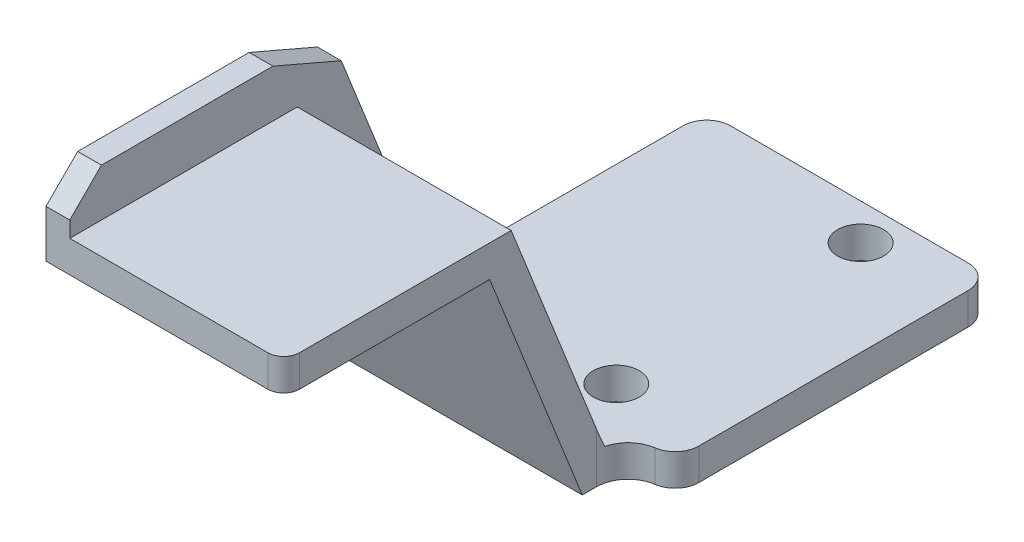
ISO-10303-21;
HEADER;
FILE_DESCRIPTION(('STEP AP214'),'2;1');
FILE_NAME('part.step','',(''),(''),'','','');
FILE_SCHEMA(('AUTOMOTIVE_DESIGN { 1 0 10303 214 1 1 1 1 }'));
ENDSEC;
DATA;
#1=APPLICATION_CONTEXT('core data for automotive mechanical design processes');
#2=APPLICATION_PROTOCOL_DEFINITION('international standard','automotive_design',2000,#1);
#3=PRODUCT_CONTEXT('',#1,'mechanical');
#4=PRODUCT('Part','Part','',(#3));
#5=PRODUCT_RELATED_PRODUCT_CATEGORY('part','',(#4));
#6=PRODUCT_DEFINITION_FORMATION('','',#4);
#7=PRODUCT_DEFINITION_CONTEXT('part definition',#1,'design');
#8=PRODUCT_DEFINITION('design','',#6,#7);
#9=PRODUCT_DEFINITION_SHAPE('','',#8);
#10=(LENGTH_UNIT() NAMED_UNIT(*) SI_UNIT(.MILLI.,.METRE.));
#11=(NAMED_UNIT(*) PLANE_ANGLE_UNIT() SI_UNIT($,.RADIAN.));
#12=(NAMED_UNIT(*) SI_UNIT($,.STERADIAN.) SOLID_ANGLE_UNIT());
#13=UNCERTAINTY_MEASURE_WITH_UNIT(LENGTH_MEASURE(1.E-05),#10,'distance_accuracy_value','');
#14=(GEOMETRIC_REPRESENTATION_CONTEXT(3) GLOBAL_UNCERTAINTY_ASSIGNED_CONTEXT((#13)) GLOBAL_UNIT_ASSIGNED_CONTEXT((#10,
#11,#12)) REPRESENTATION_CONTEXT('',''));
#15=CARTESIAN_POINT('',(0.,0.,0.));
#16=DIRECTION('',(0.,0.,1.));
#17=DIRECTION('',(1.,0.,0.));
#18=AXIS2_PLACEMENT_3D('',#15,#16,#17);
#19=CARTESIAN_POINT('',(6.,2.,11.5));
#20=DIRECTION('',(0.,0.369359356857695,-0.929286643346212));
#21=DIRECTION('',(0.,0.929286643346212,0.369359356857695));
#22=AXIS2_PLACEMENT_3D('',#19,#20,#21);
#23=PLANE('',#22);
#24=DIRECTION('',(-1.,0.,0.));
#25=VECTOR('',#24,1.);
#26=CARTESIAN_POINT('',(6.,2.,11.5));
#27=LINE('',#26,#25);
#28=CARTESIAN_POINT('',(6.05459266711916,2.,11.5));
#29=VERTEX_POINT('',#28);
#30=CARTESIAN_POINT('',(-7.5,2.,11.5));
#31=VERTEX_POINT('',#30);
#32=EDGE_CURVE('E195',#29,#31,#27,.T.);
#33=ORIENTED_EDGE('',*,*,#32,.T.);
#34=DIRECTION('',(0.,0.929286643346212,0.369359356857695));
#35=VECTOR('',#34,1.);
#36=CARTESIAN_POINT('',(-7.5,16.7,17.3427424785285));
#37=LINE('',#36,#35);
#38=CARTESIAN_POINT('',(-7.5,16.7,17.3427424785285));
#39=VERTEX_POINT('',#38);
#40=EDGE_CURVE('E198',#31,#39,#37,.T.);
#41=ORIENTED_EDGE('',*,*,#40,.T.);
#42=DIRECTION('',(-1.,0.,0.));
#43=VECTOR('',#42,1.);
#44=CARTESIAN_POINT('',(6.,16.7,17.3427424785285));
#45=LINE('',#44,#43);
#46=CARTESIAN_POINT('',(6.,16.7,17.3427424785285));
#47=VERTEX_POINT('',#46);
#48=EDGE_CURVE('E205',#47,#39,#45,.T.);
#49=ORIENTED_EDGE('',*,*,#48,.F.);
#50=DIRECTION('',(0.,-0.929286643346212,-0.369359356857695));
#51=VECTOR('',#50,1.);
#52=CARTESIAN_POINT('',(6.,2.,11.5));
#53=LINE('',#52,#51);
#54=CARTESIAN_POINT('',(6.,3.16765265071947,11.9641016151378));
#55=VERTEX_POINT('',#54);
#56=EDGE_CURVE('E279',#47,#55,#53,.T.);
#57=ORIENTED_EDGE('',*,*,#56,.T.);
#58=CARTESIAN_POINT('',(8.,3.16765265071947,11.9641016151378));
#59=DIRECTION('',(0.,0.369359356857695,-0.929286643346212));
#60=DIRECTION('',(0.,-0.929286643346212,-0.369359356857695));
#61=AXIS2_PLACEMENT_3D('',#58,#59,#60);
#62=ELLIPSE('',#61,5.41478092504517,2.);
#63=EDGE_CURVE('E62',#55,#29,#62,.F.);
#64=ORIENTED_EDGE('',*,*,#63,.T.);
#65=EDGE_LOOP('',(#33,#41,#49,#57,#64));
#66=FACE_BOUND('',#65,.T.);
#67=ADVANCED_FACE('F53',(#66),#23,.T.);
#68=CARTESIAN_POINT('',(6.,16.7,17.3427424785285));
#69=DIRECTION('',(0.,1.,0.));
#70=DIRECTION('',(0.,0.,1.));
#71=AXIS2_PLACEMENT_3D('',#68,#69,#70);
#72=PLANE('',#71);
#73=DIRECTION('',(-1.,0.,0.));
#74=VECTOR('',#73,1.);
#75=CARTESIAN_POINT('',(6.,16.7,31.7));
#76=LINE('',#75,#74);
#77=CARTESIAN_POINT('',(5.,16.7,31.7));
#78=VERTEX_POINT('',#77);
#79=CARTESIAN_POINT('',(-7.49999999999999,16.7,31.7));
#80=VERTEX_POINT('',#79);
#81=EDGE_CURVE('E295',#78,#80,#76,.T.);
#82=ORIENTED_EDGE('',*,*,#81,.F.);
#83=CARTESIAN_POINT('',(5.,16.7,30.7));
#84=DIRECTION('',(0.,1.,0.));
#85=DIRECTION('',(0.,0.,1.));
#86=AXIS2_PLACEMENT_3D('',#83,#84,#85);
#87=CIRCLE('',#86,1.);
#88=CARTESIAN_POINT('',(6.,16.7,30.7));
#89=VERTEX_POINT('',#88);
#90=EDGE_CURVE('E409',#78,#89,#87,.T.);
#91=ORIENTED_EDGE('',*,*,#90,.T.);
#92=DIRECTION('',(0.,0.,-1.));
#93=VECTOR('',#92,1.);
#94=CARTESIAN_POINT('',(6.,16.7,17.3427424785285));
#95=LINE('',#94,#93);
#96=EDGE_CURVE('E276',#89,#47,#95,.T.);
#97=ORIENTED_EDGE('',*,*,#96,.T.);
#98=ORIENTED_EDGE('',*,*,#48,.T.);
#99=DIRECTION('',(0.,0.,1.));
#100=VECTOR('',#99,1.);
#101=CARTESIAN_POINT('',(-7.49999999999999,16.7,31.7));
#102=LINE('',#101,#100);
#103=EDGE_CURVE('E215',#39,#80,#102,.T.);
#104=ORIENTED_EDGE('',*,*,#103,.T.);
#105=EDGE_LOOP('',(#82,#91,#97,#98,#104));
#106=FACE_BOUND('',#105,.T.);
#107=ADVANCED_FACE('F535',(#106),#72,.T.);
#108=CARTESIAN_POINT('',(0.,2.,0.));
#109=DIRECTION('',(0.,-1.,0.));
#110=DIRECTION('',(0.,0.,-1.));
#111=AXIS2_PLACEMENT_3D('',#108,#109,#110);
#112=PLANE('',#111);
#113=DIRECTION('',(0.,0.,1.));
#114=VECTOR('',#113,1.);
#115=CARTESIAN_POINT('',(-9.00000000000001,2.,-9.99999999999999));
#116=LINE('',#115,#114);
#117=CARTESIAN_POINT('',(-9.00000000000001,2.,-8.49999999999999));
#118=VERTEX_POINT('',#117);
#119=CARTESIAN_POINT('',(-9.,2.,10.));
#120=VERTEX_POINT('',#119);
#121=EDGE_CURVE('E74',#118,#120,#116,.T.);
#122=ORIENTED_EDGE('',*,*,#121,.T.);
#123=DIRECTION('',(-1.,0.,0.));
#124=VECTOR('',#123,1.);
#125=CARTESIAN_POINT('',(-5.37867965644036,2.,10.));
#126=LINE('',#125,#124);
#127=CARTESIAN_POINT('',(-7.5,2.,10.));
#128=VERTEX_POINT('',#127);
#129=EDGE_CURVE('E69',#128,#120,#126,.T.);
#130=ORIENTED_EDGE('',*,*,#129,.F.);
#131=DIRECTION('',(0.,0.,-1.));
#132=VECTOR('',#131,1.);
#133=CARTESIAN_POINT('',(-7.5,2.,10.));
#134=LINE('',#133,#132);
#135=EDGE_CURVE('E211',#31,#128,#134,.T.);
#136=ORIENTED_EDGE('',*,*,#135,.F.);
#137=ORIENTED_EDGE('',*,*,#32,.F.);
#138=CARTESIAN_POINT('',(8.,2.,11.9641016151378));
#139=DIRECTION('',(0.,-1.,0.));
#140=DIRECTION('',(0.,0.,-1.));
#141=AXIS2_PLACEMENT_3D('',#138,#139,#140);
#142=CIRCLE('',#141,2.);
#143=CARTESIAN_POINT('',(7.71428571428571,2.,9.98461497791618));
#144=VERTEX_POINT('',#143);
#145=EDGE_CURVE('E11',#29,#144,#142,.T.);
#146=ORIENTED_EDGE('',*,*,#145,.T.);
#147=CARTESIAN_POINT('',(7.5,2.,8.5));
#148=DIRECTION('',(0.,-1.,0.));
#149=DIRECTION('',(0.,0.,-1.));
#150=AXIS2_PLACEMENT_3D('',#147,#148,#149);
#151=CIRCLE('',#150,1.5);
#152=CARTESIAN_POINT('',(9.,2.,8.5));
#153=VERTEX_POINT('',#152);
#154=EDGE_CURVE('E391',#144,#153,#151,.F.);
#155=ORIENTED_EDGE('',*,*,#154,.T.);
#156=DIRECTION('',(0.,0.,-1.));
#157=VECTOR('',#156,1.);
#158=CARTESIAN_POINT('',(9.,2.,-10.));
#159=LINE('',#158,#157);
#160=CARTESIAN_POINT('',(9.,2.,-8.5));
#161=VERTEX_POINT('',#160);
#162=EDGE_CURVE('E325',#153,#161,#159,.T.);
#163=ORIENTED_EDGE('',*,*,#162,.T.);
#164=CARTESIAN_POINT('',(7.5,2.,-8.5));
#165=DIRECTION('',(0.,-1.,0.));
#166=DIRECTION('',(0.,0.,-1.));
#167=AXIS2_PLACEMENT_3D('',#164,#165,#166);
#168=CIRCLE('',#167,1.5);
#169=CARTESIAN_POINT('',(7.5,2.,-10.));
#170=VERTEX_POINT('',#169);
#171=EDGE_CURVE('E388',#161,#170,#168,.F.);
#172=ORIENTED_EDGE('',*,*,#171,.T.);
#173=DIRECTION('',(-1.,0.,0.));
#174=VECTOR('',#173,1.);
#175=CARTESIAN_POINT('',(9.,2.,-10.));
#176=LINE('',#175,#174);
#177=CARTESIAN_POINT('',(-7.50000000000001,2.,-9.99999999999999));
#178=VERTEX_POINT('',#177);
#179=EDGE_CURVE('E330',#170,#178,#176,.T.);
#180=ORIENTED_EDGE('',*,*,#179,.T.);
#181=CARTESIAN_POINT('',(-7.50000000000001,2.,-8.49999999999999));
#182=DIRECTION('',(0.,-1.,0.));
#183=DIRECTION('',(0.,0.,-1.));
#184=AXIS2_PLACEMENT_3D('',#181,#182,#183);
#185=CIRCLE('',#184,1.5);
#186=EDGE_CURVE('E385',#178,#118,#185,.F.);
#187=ORIENTED_EDGE('',*,*,#186,.T.);
#188=EDGE_LOOP('',(#122,#130,#136,#137,#146,#155,#163,#172,#180,#187));
#189=FACE_BOUND('',#188,.T.);
#190=CARTESIAN_POINT('',(3.,2.,-7.71));
#191=DIRECTION('',(0.,1.,0.));
#192=DIRECTION('',(0.,0.,1.));
#193=AXIS2_PLACEMENT_3D('',#190,#191,#192);
#194=CIRCLE('',#193,1.45);
#195=CARTESIAN_POINT('',(3.,2.,-6.26));
#196=VERTEX_POINT('',#195);
#197=EDGE_CURVE('E315',#196,#196,#194,.T.);
#198=ORIENTED_EDGE('',*,*,#197,.F.);
#199=EDGE_LOOP('',(#198));
#200=FACE_BOUND('',#199,.T.);
#201=CARTESIAN_POINT('',(3.,2.,7.71));
#202=DIRECTION('',(0.,1.,0.));
#203=DIRECTION('',(0.,0.,1.));
#204=AXIS2_PLACEMENT_3D('',#201,#202,#203);
#205=CIRCLE('',#204,1.45);
#206=CARTESIAN_POINT('',(3.,2.,9.16));
#207=VERTEX_POINT('',#206);
#208=EDGE_CURVE('E307',#207,#207,#205,.T.);
#209=ORIENTED_EDGE('',*,*,#208,.F.);
#210=EDGE_LOOP('',(#209));
#211=FACE_BOUND('',#210,.T.);
#212=ADVANCED_FACE('F219',(#189,#200,#211),#112,.F.);
#213=CARTESIAN_POINT('',(0.,0.,0.));
#214=DIRECTION('',(0.,-1.,0.));
#215=DIRECTION('',(0.,0.,-1.));
#216=AXIS2_PLACEMENT_3D('',#213,#214,#215);
#217=PLANE('',#216);
#218=CARTESIAN_POINT('',(3.,0.,-7.71));
#219=DIRECTION('',(0.,1.,0.));
#220=DIRECTION('',(0.,0.,1.));
#221=AXIS2_PLACEMENT_3D('',#218,#219,#220);
#222=CIRCLE('',#221,1.45);
#223=CARTESIAN_POINT('',(3.,0.,-6.26));
#224=VERTEX_POINT('',#223);
#225=EDGE_CURVE('E311',#224,#224,#222,.T.);
#226=ORIENTED_EDGE('',*,*,#225,.T.);
#227=EDGE_LOOP('',(#226));
#228=FACE_BOUND('',#227,.T.);
#229=DIRECTION('',(0.,0.,-1.));
#230=VECTOR('',#229,1.);
#231=CARTESIAN_POINT('',(9.,0.,-10.));
#232=LINE('',#231,#230);
#233=CARTESIAN_POINT('',(9.,0.,8.5));
#234=VERTEX_POINT('',#233);
#235=CARTESIAN_POINT('',(9.,0.,-8.5));
#236=VERTEX_POINT('',#235);
#237=EDGE_CURVE('E337',#234,#236,#232,.T.);
#238=ORIENTED_EDGE('',*,*,#237,.F.);
#239=CARTESIAN_POINT('',(7.5,0.,8.5));
#240=DIRECTION('',(0.,-1.,0.));
#241=DIRECTION('',(0.,0.,-1.));
#242=AXIS2_PLACEMENT_3D('',#239,#240,#241);
#243=CIRCLE('',#242,1.5);
#244=CARTESIAN_POINT('',(7.71428571428571,0.,9.98461497791618));
#245=VERTEX_POINT('',#244);
#246=EDGE_CURVE('E381',#234,#245,#243,.T.);
#247=ORIENTED_EDGE('',*,*,#246,.T.);
#248=CARTESIAN_POINT('',(8.,0.,11.9641016151378));
#249=DIRECTION('',(0.,-1.,0.));
#250=DIRECTION('',(0.,0.,-1.));
#251=AXIS2_PLACEMENT_3D('',#248,#249,#250);
#252=CIRCLE('',#251,2.);
#253=CARTESIAN_POINT('',(6.,0.,11.9641016151378));
#254=VERTEX_POINT('',#253);
#255=EDGE_CURVE('E424',#245,#254,#252,.F.);
#256=ORIENTED_EDGE('',*,*,#255,.T.);
#257=DIRECTION('',(0.,0.,1.));
#258=VECTOR('',#257,1.);
#259=CARTESIAN_POINT('',(6.,0.,10.));
#260=LINE('',#259,#258);
#261=CARTESIAN_POINT('',(6.,0.,12.8572575214715));
#262=VERTEX_POINT('',#261);
#263=EDGE_CURVE('E264',#254,#262,#260,.T.);
#264=ORIENTED_EDGE('',*,*,#263,.T.);
#265=DIRECTION('',(-1.,0.,0.));
#266=VECTOR('',#265,1.);
#267=CARTESIAN_POINT('',(6.,0.,12.8572575214715));
#268=LINE('',#267,#266);
#269=CARTESIAN_POINT('',(-9.,0.,12.8572575214715));
#270=VERTEX_POINT('',#269);
#271=EDGE_CURVE('E282',#262,#270,#268,.T.);
#272=ORIENTED_EDGE('',*,*,#271,.T.);
#273=DIRECTION('',(0.,0.,1.));
#274=VECTOR('',#273,1.);
#275=CARTESIAN_POINT('',(-9.00000000000001,0.,-9.99999999999999));
#276=LINE('',#275,#274);
#277=CARTESIAN_POINT('',(-9.00000000000001,0.,-8.49999999999999));
#278=VERTEX_POINT('',#277);
#279=EDGE_CURVE('E319',#278,#270,#276,.T.);
#280=ORIENTED_EDGE('',*,*,#279,.F.);
#281=CARTESIAN_POINT('',(-7.50000000000001,0.,-8.49999999999999));
#282=DIRECTION('',(0.,-1.,0.));
#283=DIRECTION('',(0.,0.,-1.));
#284=AXIS2_PLACEMENT_3D('',#281,#282,#283);
#285=CIRCLE('',#284,1.5);
#286=CARTESIAN_POINT('',(-7.50000000000001,0.,-9.99999999999999));
#287=VERTEX_POINT('',#286);
#288=EDGE_CURVE('E375',#278,#287,#285,.T.);
#289=ORIENTED_EDGE('',*,*,#288,.T.);
#290=DIRECTION('',(-1.,0.,0.));
#291=VECTOR('',#290,1.);
#292=CARTESIAN_POINT('',(9.,0.,-10.));
#293=LINE('',#292,#291);
#294=CARTESIAN_POINT('',(7.5,0.,-10.));
#295=VERTEX_POINT('',#294);
#296=EDGE_CURVE('E326',#295,#287,#293,.T.);
#297=ORIENTED_EDGE('',*,*,#296,.F.);
#298=CARTESIAN_POINT('',(7.5,0.,-8.5));
#299=DIRECTION('',(0.,-1.,0.));
#300=DIRECTION('',(0.,0.,-1.));
#301=AXIS2_PLACEMENT_3D('',#298,#299,#300);
#302=CIRCLE('',#301,1.5);
#303=EDGE_CURVE('E378',#295,#236,#302,.T.);
#304=ORIENTED_EDGE('',*,*,#303,.T.);
#305=EDGE_LOOP('',(#238,#247,#256,#264,#272,#280,#289,#297,#304));
#306=FACE_BOUND('',#305,.T.);
#307=CARTESIAN_POINT('',(3.,0.,7.71));
#308=DIRECTION('',(0.,1.,0.));
#309=DIRECTION('',(0.,0.,1.));
#310=AXIS2_PLACEMENT_3D('',#307,#308,#309);
#311=CIRCLE('',#310,1.45);
#312=CARTESIAN_POINT('',(3.,0.,9.16));
#313=VERTEX_POINT('',#312);
#314=EDGE_CURVE('E204',#313,#313,#311,.T.);
#315=ORIENTED_EDGE('',*,*,#314,.T.);
#316=EDGE_LOOP('',(#315));
#317=FACE_BOUND('',#316,.T.);
#318=ADVANCED_FACE('F556',(#228,#306,#317),#217,.T.);
#319=CARTESIAN_POINT('',(-9.00000000000001,2.,-9.99999999999999));
#320=DIRECTION('',(1.,0.,0.));
#321=DIRECTION('',(0.,0.,-1.));
#322=AXIS2_PLACEMENT_3D('',#319,#320,#321);
#323=PLANE('',#322);
#324=ORIENTED_EDGE('',*,*,#121,.F.);
#325=DIRECTION('',(0.,-1.,0.));
#326=VECTOR('',#325,1.);
#327=CARTESIAN_POINT('',(-9.00000000000001,2.,-8.49999999999999));
#328=LINE('',#327,#326);
#329=EDGE_CURVE('E401',#118,#278,#328,.T.);
#330=ORIENTED_EDGE('',*,*,#329,.T.);
#331=ORIENTED_EDGE('',*,*,#279,.T.);
#332=DIRECTION('',(0.,0.929286643346212,0.369359356857695));
#333=VECTOR('',#332,1.);
#334=CARTESIAN_POINT('',(-9.,0.,12.8572575214715));
#335=LINE('',#334,#333);
#336=CARTESIAN_POINT('',(-9.,14.7,18.7));
#337=VERTEX_POINT('',#336);
#338=EDGE_CURVE('E263',#270,#337,#335,.T.);
#339=ORIENTED_EDGE('',*,*,#338,.T.);
#340=DIRECTION('',(0.,0.,1.));
#341=VECTOR('',#340,1.);
#342=CARTESIAN_POINT('',(-9.,14.7,18.7));
#343=LINE('',#342,#341);
#344=CARTESIAN_POINT('',(-9.,14.7,31.7));
#345=VERTEX_POINT('',#344);
#346=EDGE_CURVE('E286',#337,#345,#343,.T.);
#347=ORIENTED_EDGE('',*,*,#346,.T.);
#348=DIRECTION('',(0.,1.,0.));
#349=VECTOR('',#348,1.);
#350=CARTESIAN_POINT('',(-9.,14.7,31.7));
#351=LINE('',#350,#349);
#352=CARTESIAN_POINT('',(-9.,17.7,31.7));
#353=VERTEX_POINT('',#352);
#354=EDGE_CURVE('E268',#345,#353,#351,.T.);
#355=ORIENTED_EDGE('',*,*,#354,.T.);
#356=DIRECTION('',(0.,-0.707106781186548,0.707106781186547));
#357=VECTOR('',#356,1.);
#358=CARTESIAN_POINT('',(-9.,17.7,31.7));
#359=LINE('',#358,#357);
#360=CARTESIAN_POINT('',(-8.99999999999999,19.7,29.7));
#361=VERTEX_POINT('',#360);
#362=EDGE_CURVE('E350',#353,#361,#359,.F.);
#363=ORIENTED_EDGE('',*,*,#362,.T.);
#364=DIRECTION('',(0.,0.,-1.));
#365=VECTOR('',#364,1.);
#366=CARTESIAN_POINT('',(-8.99999999999999,19.7,31.7));
#367=LINE('',#366,#365);
#368=CARTESIAN_POINT('',(-9.,19.7,18.8787485621009));
#369=VERTEX_POINT('',#368);
#370=EDGE_CURVE('E222',#361,#369,#367,.T.);
#371=ORIENTED_EDGE('',*,*,#370,.T.);
#372=DIRECTION('',(0.,0.395928381247414,0.918281393104969));
#373=VECTOR('',#372,1.);
#374=CARTESIAN_POINT('',(-9.,19.7,18.8787485621009));
#375=LINE('',#374,#373);
#376=CARTESIAN_POINT('',(-9.,17.8414267133076,14.568137482606));
#377=VERTEX_POINT('',#376);
#378=EDGE_CURVE('E353',#369,#377,#375,.F.);
#379=ORIENTED_EDGE('',*,*,#378,.T.);
#380=DIRECTION('',(0.,-0.929286643346212,-0.369359356857695));
#381=VECTOR('',#380,1.);
#382=CARTESIAN_POINT('',(-9.,19.7,15.3068561963214));
#383=LINE('',#382,#381);
#384=CARTESIAN_POINT('',(-9.,10.1221713875678,11.5));
#385=VERTEX_POINT('',#384);
#386=EDGE_CURVE('E230',#377,#385,#383,.T.);
#387=ORIENTED_EDGE('',*,*,#386,.T.);
#388=DIRECTION('',(0.,-1.,0.));
#389=VECTOR('',#388,1.);
#390=CARTESIAN_POINT('',(-9.,10.1221713875678,11.5));
#391=LINE('',#390,#389);
#392=CARTESIAN_POINT('',(-9.,3.5,11.5));
#393=VERTEX_POINT('',#392);
#394=EDGE_CURVE('E243',#385,#393,#391,.T.);
#395=ORIENTED_EDGE('',*,*,#394,.T.);
#396=CARTESIAN_POINT('',(-9.,3.5,10.));
#397=DIRECTION('',(1.,0.,0.));
#398=DIRECTION('',(0.,0.,1.));
#399=AXIS2_PLACEMENT_3D('',#396,#397,#398);
#400=CIRCLE('',#399,1.5);
#401=EDGE_CURVE('E457',#393,#120,#400,.T.);
#402=ORIENTED_EDGE('',*,*,#401,.T.);
#403=EDGE_LOOP('',(#324,#330,#331,#339,#347,#355,#363,#371,#379,#387,#395,#402));
#404=FACE_BOUND('',#403,.T.);
#405=ADVANCED_FACE('F501',(#404),#323,.F.);
#406=CARTESIAN_POINT('',(9.,2.,-10.));
#407=DIRECTION('',(-1.,0.,0.));
#408=DIRECTION('',(0.,0.,1.));
#409=AXIS2_PLACEMENT_3D('',#406,#407,#408);
#410=PLANE('',#409);
#411=ORIENTED_EDGE('',*,*,#162,.F.);
#412=DIRECTION('',(0.,-1.,0.));
#413=VECTOR('',#412,1.);
#414=CARTESIAN_POINT('',(9.,2.,8.5));
#415=LINE('',#414,#413);
#416=EDGE_CURVE('E371',#153,#234,#415,.T.);
#417=ORIENTED_EDGE('',*,*,#416,.T.);
#418=ORIENTED_EDGE('',*,*,#237,.T.);
#419=DIRECTION('',(0.,-1.,0.));
#420=VECTOR('',#419,1.);
#421=CARTESIAN_POINT('',(9.,2.,-8.5));
#422=LINE('',#421,#420);
#423=EDGE_CURVE('E368',#236,#161,#422,.F.);
#424=ORIENTED_EDGE('',*,*,#423,.T.);
#425=EDGE_LOOP('',(#411,#417,#418,#424));
#426=FACE_BOUND('',#425,.T.);
#427=ADVANCED_FACE('F553',(#426),#410,.F.);
#428=CARTESIAN_POINT('',(9.,2.,-10.));
#429=DIRECTION('',(0.,0.,1.));
#430=DIRECTION('',(1.,0.,0.));
#431=AXIS2_PLACEMENT_3D('',#428,#429,#430);
#432=PLANE('',#431);
#433=ORIENTED_EDGE('',*,*,#179,.F.);
#434=DIRECTION('',(0.,-1.,0.));
#435=VECTOR('',#434,1.);
#436=CARTESIAN_POINT('',(7.5,2.,-10.));
#437=LINE('',#436,#435);
#438=EDGE_CURVE('E397',#170,#295,#437,.T.);
#439=ORIENTED_EDGE('',*,*,#438,.T.);
#440=ORIENTED_EDGE('',*,*,#296,.T.);
#441=DIRECTION('',(0.,-1.,0.));
#442=VECTOR('',#441,1.);
#443=CARTESIAN_POINT('',(-7.50000000000001,2.,-9.99999999999999));
#444=LINE('',#443,#442);
#445=EDGE_CURVE('E394',#287,#178,#444,.F.);
#446=ORIENTED_EDGE('',*,*,#445,.T.);
#447=EDGE_LOOP('',(#433,#439,#440,#446));
#448=FACE_BOUND('',#447,.T.);
#449=ADVANCED_FACE('F565',(#448),#432,.F.);
#450=CARTESIAN_POINT('',(3.,2.,-7.71));
#451=DIRECTION('',(0.,-1.,0.));
#452=DIRECTION('',(0.,0.,-1.));
#453=AXIS2_PLACEMENT_3D('',#450,#451,#452);
#454=CYLINDRICAL_SURFACE('',#453,1.45);
#455=ORIENTED_EDGE('',*,*,#197,.T.);
#456=EDGE_LOOP('',(#455));
#457=FACE_BOUND('',#456,.T.);
#458=ORIENTED_EDGE('',*,*,#225,.F.);
#459=EDGE_LOOP('',(#458));
#460=FACE_BOUND('',#459,.T.);
#461=ADVANCED_FACE('F604',(#457,#460),#454,.F.);
#462=CARTESIAN_POINT('',(3.,2.,7.71));
#463=DIRECTION('',(0.,-1.,0.));
#464=DIRECTION('',(0.,0.,-1.));
#465=AXIS2_PLACEMENT_3D('',#462,#463,#464);
#466=CYLINDRICAL_SURFACE('',#465,1.45);
#467=ORIENTED_EDGE('',*,*,#208,.T.);
#468=EDGE_LOOP('',(#467));
#469=FACE_BOUND('',#468,.T.);
#470=ORIENTED_EDGE('',*,*,#314,.F.);
#471=EDGE_LOOP('',(#470));
#472=FACE_BOUND('',#471,.T.);
#473=ADVANCED_FACE('F597',(#469,#472),#466,.F.);
#474=CARTESIAN_POINT('',(6.,14.7,31.7));
#475=DIRECTION('',(0.,0.,1.));
#476=DIRECTION('',(1.,0.,0.));
#477=AXIS2_PLACEMENT_3D('',#474,#475,#476);
#478=PLANE('',#477);
#479=DIRECTION('',(-1.,0.,0.));
#480=VECTOR('',#479,1.);
#481=CARTESIAN_POINT('',(6.,14.7,31.7));
#482=LINE('',#481,#480);
#483=CARTESIAN_POINT('',(5.,14.7,31.7));
#484=VERTEX_POINT('',#483);
#485=EDGE_CURVE('E298',#484,#345,#482,.T.);
#486=ORIENTED_EDGE('',*,*,#485,.F.);
#487=DIRECTION('',(0.,1.,0.));
#488=VECTOR('',#487,1.);
#489=CARTESIAN_POINT('',(5.,16.7,31.7));
#490=LINE('',#489,#488);
#491=EDGE_CURVE('E405',#484,#78,#490,.T.);
#492=ORIENTED_EDGE('',*,*,#491,.T.);
#493=ORIENTED_EDGE('',*,*,#81,.T.);
#494=DIRECTION('',(0.,1.,0.));
#495=VECTOR('',#494,1.);
#496=CARTESIAN_POINT('',(-7.49999999999999,16.7,31.7));
#497=LINE('',#496,#495);
#498=CARTESIAN_POINT('',(-7.49999999999999,17.7,31.7));
#499=VERTEX_POINT('',#498);
#500=EDGE_CURVE('E238',#80,#499,#497,.T.);
#501=ORIENTED_EDGE('',*,*,#500,.T.);
#502=DIRECTION('',(-1.,0.,0.));
#503=VECTOR('',#502,1.);
#504=CARTESIAN_POINT('',(6.,17.7,31.7));
#505=LINE('',#504,#503);
#506=EDGE_CURVE('E364',#499,#353,#505,.T.);
#507=ORIENTED_EDGE('',*,*,#506,.T.);
#508=ORIENTED_EDGE('',*,*,#354,.F.);
#509=EDGE_LOOP('',(#486,#492,#493,#501,#507,#508));
#510=FACE_BOUND('',#509,.T.);
#511=ADVANCED_FACE('F530',(#510),#478,.T.);
#512=CARTESIAN_POINT('',(6.,14.7,18.7));
#513=DIRECTION('',(0.,-1.,0.));
#514=DIRECTION('',(0.,0.,-1.));
#515=AXIS2_PLACEMENT_3D('',#512,#513,#514);
#516=PLANE('',#515);
#517=DIRECTION('',(0.,0.,1.));
#518=VECTOR('',#517,1.);
#519=CARTESIAN_POINT('',(6.,14.7,18.7));
#520=LINE('',#519,#518);
#521=CARTESIAN_POINT('',(6.,14.7,18.7));
#522=VERTEX_POINT('',#521);
#523=CARTESIAN_POINT('',(6.,14.7,30.7));
#524=VERTEX_POINT('',#523);
#525=EDGE_CURVE('E272',#522,#524,#520,.T.);
#526=ORIENTED_EDGE('',*,*,#525,.T.);
#527=CARTESIAN_POINT('',(5.,14.7,30.7));
#528=DIRECTION('',(0.,-1.,0.));
#529=DIRECTION('',(0.,0.,-1.));
#530=AXIS2_PLACEMENT_3D('',#527,#528,#529);
#531=CIRCLE('',#530,1.);
#532=EDGE_CURVE('E415',#524,#484,#531,.T.);
#533=ORIENTED_EDGE('',*,*,#532,.T.);
#534=ORIENTED_EDGE('',*,*,#485,.T.);
#535=ORIENTED_EDGE('',*,*,#346,.F.);
#536=DIRECTION('',(-1.,0.,0.));
#537=VECTOR('',#536,1.);
#538=CARTESIAN_POINT('',(6.,14.7,18.7));
#539=LINE('',#538,#537);
#540=EDGE_CURVE('E301',#522,#337,#539,.T.);
#541=ORIENTED_EDGE('',*,*,#540,.F.);
#542=EDGE_LOOP('',(#526,#533,#534,#535,#541));
#543=FACE_BOUND('',#542,.T.);
#544=ADVANCED_FACE('F577',(#543),#516,.T.);
#545=CARTESIAN_POINT('',(6.,0.,12.8572575214715));
#546=DIRECTION('',(0.,-0.369359356857695,0.929286643346212));
#547=DIRECTION('',(0.,-0.929286643346212,-0.369359356857695));
#548=AXIS2_PLACEMENT_3D('',#545,#546,#547);
#549=PLANE('',#548);
#550=ORIENTED_EDGE('',*,*,#338,.F.);
#551=ORIENTED_EDGE('',*,*,#271,.F.);
#552=DIRECTION('',(0.,0.929286643346212,0.369359356857695));
#553=VECTOR('',#552,1.);
#554=CARTESIAN_POINT('',(6.,0.,12.8572575214715));
#555=LINE('',#554,#553);
#556=EDGE_CURVE('E267',#262,#522,#555,.T.);
#557=ORIENTED_EDGE('',*,*,#556,.T.);
#558=ORIENTED_EDGE('',*,*,#540,.T.);
#559=EDGE_LOOP('',(#550,#551,#557,#558));
#560=FACE_BOUND('',#559,.T.);
#561=ADVANCED_FACE('F574',(#560),#549,.T.);
#562=CARTESIAN_POINT('',(6.,0.,0.));
#563=DIRECTION('',(-1.,0.,0.));
#564=DIRECTION('',(0.,0.,1.));
#565=AXIS2_PLACEMENT_3D('',#562,#563,#564);
#566=PLANE('',#565);
#567=ORIENTED_EDGE('',*,*,#263,.F.);
#568=DIRECTION('',(0.,-1.,0.));
#569=VECTOR('',#568,1.);
#570=CARTESIAN_POINT('',(6.,0.,11.9641016151378));
#571=LINE('',#570,#569);
#572=EDGE_CURVE('E421',#254,#55,#571,.F.);
#573=ORIENTED_EDGE('',*,*,#572,.T.);
#574=ORIENTED_EDGE('',*,*,#56,.F.);
#575=ORIENTED_EDGE('',*,*,#96,.F.);
#576=DIRECTION('',(0.,1.,0.));
#577=VECTOR('',#576,1.);
#578=CARTESIAN_POINT('',(6.,14.7,30.7));
#579=LINE('',#578,#577);
#580=EDGE_CURVE('E412',#89,#524,#579,.F.);
#581=ORIENTED_EDGE('',*,*,#580,.T.);
#582=ORIENTED_EDGE('',*,*,#525,.F.);
#583=ORIENTED_EDGE('',*,*,#556,.F.);
#584=EDGE_LOOP('',(#567,#573,#574,#575,#581,#582,#583));
#585=FACE_BOUND('',#584,.T.);
#586=ADVANCED_FACE('F540',(#585),#566,.F.);
#587=CARTESIAN_POINT('',(-7.5,10.1221713875678,11.5));
#588=DIRECTION('',(0.,0.,-1.));
#589=DIRECTION('',(-1.,0.,0.));
#590=AXIS2_PLACEMENT_3D('',#587,#588,#589);
#591=PLANE('',#590);
#592=DIRECTION('',(-1.,0.,0.));
#593=VECTOR('',#592,1.);
#594=CARTESIAN_POINT('',(-5.37867965644036,3.5,11.5));
#595=LINE('',#594,#593);
#596=CARTESIAN_POINT('',(-7.5,3.5,11.5));
#597=VERTEX_POINT('',#596);
#598=EDGE_CURVE('E233',#597,#393,#595,.T.);
#599=ORIENTED_EDGE('',*,*,#598,.T.);
#600=ORIENTED_EDGE('',*,*,#394,.F.);
#601=DIRECTION('',(-1.,0.,0.));
#602=VECTOR('',#601,1.);
#603=CARTESIAN_POINT('',(-7.5,10.1221713875678,11.5));
#604=LINE('',#603,#602);
#605=CARTESIAN_POINT('',(-7.5,10.1221713875678,11.5));
#606=VERTEX_POINT('',#605);
#607=EDGE_CURVE('E253',#606,#385,#604,.T.);
#608=ORIENTED_EDGE('',*,*,#607,.F.);
#609=DIRECTION('',(0.,-1.,0.));
#610=VECTOR('',#609,1.);
#611=CARTESIAN_POINT('',(-7.5,10.1221713875678,11.5));
#612=LINE('',#611,#610);
#613=EDGE_CURVE('E217',#606,#597,#612,.T.);
#614=ORIENTED_EDGE('',*,*,#613,.T.);
#615=EDGE_LOOP('',(#599,#600,#608,#614));
#616=FACE_BOUND('',#615,.T.);
#617=ADVANCED_FACE('F511',(#616),#591,.T.);
#618=CARTESIAN_POINT('',(-7.5,19.7,15.3068561963214));
#619=DIRECTION('',(0.,0.369359356857695,-0.929286643346212));
#620=DIRECTION('',(0.,0.929286643346212,0.369359356857695));
#621=AXIS2_PLACEMENT_3D('',#618,#619,#620);
#622=PLANE('',#621);
#623=ORIENTED_EDGE('',*,*,#386,.F.);
#624=DIRECTION('',(1.,0.,0.));
#625=VECTOR('',#624,1.);
#626=CARTESIAN_POINT('',(-7.5,17.8414267133076,14.568137482606));
#627=LINE('',#626,#625);
#628=CARTESIAN_POINT('',(-7.5,17.8414267133076,14.568137482606));
#629=VERTEX_POINT('',#628);
#630=EDGE_CURVE('E355',#377,#629,#627,.T.);
#631=ORIENTED_EDGE('',*,*,#630,.T.);
#632=DIRECTION('',(0.,-0.929286643346212,-0.369359356857695));
#633=VECTOR('',#632,1.);
#634=CARTESIAN_POINT('',(-7.5,19.7,15.3068561963214));
#635=LINE('',#634,#633);
#636=EDGE_CURVE('E247',#629,#606,#635,.T.);
#637=ORIENTED_EDGE('',*,*,#636,.T.);
#638=ORIENTED_EDGE('',*,*,#607,.T.);
#639=EDGE_LOOP('',(#623,#631,#637,#638));
#640=FACE_BOUND('',#639,.T.);
#641=ADVANCED_FACE('F514',(#640),#622,.T.);
#642=CARTESIAN_POINT('',(-7.49999999999999,19.7,31.7));
#643=DIRECTION('',(0.,1.,0.));
#644=DIRECTION('',(0.,0.,1.));
#645=AXIS2_PLACEMENT_3D('',#642,#643,#644);
#646=PLANE('',#645);
#647=DIRECTION('',(0.,0.,-1.));
#648=VECTOR('',#647,1.);
#649=CARTESIAN_POINT('',(-7.49999999999999,19.7,31.7));
#650=LINE('',#649,#648);
#651=CARTESIAN_POINT('',(-7.5,19.7,29.7));
#652=VERTEX_POINT('',#651);
#653=CARTESIAN_POINT('',(-7.5,19.7,18.8787485621009));
#654=VERTEX_POINT('',#653);
#655=EDGE_CURVE('E242',#652,#654,#650,.T.);
#656=ORIENTED_EDGE('',*,*,#655,.T.);
#657=DIRECTION('',(-1.,0.,0.));
#658=VECTOR('',#657,1.);
#659=CARTESIAN_POINT('',(-7.5,19.7,18.8787485621009));
#660=LINE('',#659,#658);
#661=EDGE_CURVE('E346',#654,#369,#660,.T.);
#662=ORIENTED_EDGE('',*,*,#661,.T.);
#663=ORIENTED_EDGE('',*,*,#370,.F.);
#664=DIRECTION('',(1.,0.,0.));
#665=VECTOR('',#664,1.);
#666=CARTESIAN_POINT('',(-7.49999999999999,19.7,29.7));
#667=LINE('',#666,#665);
#668=EDGE_CURVE('E334',#361,#652,#667,.T.);
#669=ORIENTED_EDGE('',*,*,#668,.T.);
#670=EDGE_LOOP('',(#656,#662,#663,#669));
#671=FACE_BOUND('',#670,.T.);
#672=ADVANCED_FACE('F522',(#671),#646,.T.);
#673=CARTESIAN_POINT('',(-7.50000000000001,0.,0.));
#674=DIRECTION('',(-1.,0.,0.));
#675=DIRECTION('',(0.,0.,1.));
#676=AXIS2_PLACEMENT_3D('',#673,#674,#675);
#677=PLANE('',#676);
#678=ORIENTED_EDGE('',*,*,#636,.F.);
#679=DIRECTION('',(0.,-0.395928381247414,-0.918281393104969));
#680=VECTOR('',#679,1.);
#681=CARTESIAN_POINT('',(-7.5,19.7,18.8787485621009));
#682=LINE('',#681,#680);
#683=EDGE_CURVE('E361',#629,#654,#682,.F.);
#684=ORIENTED_EDGE('',*,*,#683,.T.);
#685=ORIENTED_EDGE('',*,*,#655,.F.);
#686=DIRECTION('',(0.,0.707106781186548,-0.707106781186547));
#687=VECTOR('',#686,1.);
#688=CARTESIAN_POINT('',(-7.49999999999999,17.7,31.7));
#689=LINE('',#688,#687);
#690=EDGE_CURVE('E358',#652,#499,#689,.F.);
#691=ORIENTED_EDGE('',*,*,#690,.T.);
#692=ORIENTED_EDGE('',*,*,#500,.F.);
#693=ORIENTED_EDGE('',*,*,#103,.F.);
#694=ORIENTED_EDGE('',*,*,#40,.F.);
#695=ORIENTED_EDGE('',*,*,#135,.T.);
#696=CARTESIAN_POINT('',(-7.5,3.5,10.));
#697=DIRECTION('',(-1.,0.,0.));
#698=DIRECTION('',(0.,0.,1.));
#699=AXIS2_PLACEMENT_3D('',#696,#697,#698);
#700=CIRCLE('',#699,1.5);
#701=EDGE_CURVE('E223',#128,#597,#700,.T.);
#702=ORIENTED_EDGE('',*,*,#701,.T.);
#703=ORIENTED_EDGE('',*,*,#613,.F.);
#704=EDGE_LOOP('',(#678,#684,#685,#691,#692,#693,#694,#695,#702,#703));
#705=FACE_BOUND('',#704,.T.);
#706=ADVANCED_FACE('F209',(#705),#677,.F.);
#707=CARTESIAN_POINT('',(-7.5,19.7,18.8787485621009));
#708=DIRECTION('',(0.,-0.918281393104969,0.395928381247414));
#709=DIRECTION('',(-1.,0.,0.));
#710=AXIS2_PLACEMENT_3D('',#707,#708,#709);
#711=PLANE('',#710);
#712=ORIENTED_EDGE('',*,*,#683,.F.);
#713=ORIENTED_EDGE('',*,*,#630,.F.);
#714=ORIENTED_EDGE('',*,*,#378,.F.);
#715=ORIENTED_EDGE('',*,*,#661,.F.);
#716=EDGE_LOOP('',(#712,#713,#714,#715));
#717=FACE_BOUND('',#716,.T.);
#718=ADVANCED_FACE('F517',(#717),#711,.F.);
#719=CARTESIAN_POINT('',(6.,17.7,31.7));
#720=DIRECTION('',(0.,-0.707106781186547,-0.707106781186548));
#721=DIRECTION('',(-1.,0.,0.));
#722=AXIS2_PLACEMENT_3D('',#719,#720,#721);
#723=PLANE('',#722);
#724=ORIENTED_EDGE('',*,*,#690,.F.);
#725=ORIENTED_EDGE('',*,*,#668,.F.);
#726=ORIENTED_EDGE('',*,*,#362,.F.);
#727=ORIENTED_EDGE('',*,*,#506,.F.);
#728=EDGE_LOOP('',(#724,#725,#726,#727));
#729=FACE_BOUND('',#728,.T.);
#730=ADVANCED_FACE('F526',(#729),#723,.F.);
#731=CARTESIAN_POINT('',(7.5,2.,8.5));
#732=DIRECTION('',(0.,-1.,0.));
#733=DIRECTION('',(0.,0.,-1.));
#734=AXIS2_PLACEMENT_3D('',#731,#732,#733);
#735=CYLINDRICAL_SURFACE('',#734,1.5);
#736=ORIENTED_EDGE('',*,*,#154,.F.);
#737=DIRECTION('',(0.,-1.,0.));
#738=VECTOR('',#737,1.);
#739=CARTESIAN_POINT('',(7.71428571428571,2.,9.98461497791618));
#740=LINE('',#739,#738);
#741=EDGE_CURVE('E418',#144,#245,#740,.T.);
#742=ORIENTED_EDGE('',*,*,#741,.T.);
#743=ORIENTED_EDGE('',*,*,#246,.F.);
#744=ORIENTED_EDGE('',*,*,#416,.F.);
#745=EDGE_LOOP('',(#736,#742,#743,#744));
#746=FACE_BOUND('',#745,.T.);
#747=ADVANCED_FACE('F550',(#746),#735,.T.);
#748=CARTESIAN_POINT('',(7.5,2.,-8.5));
#749=DIRECTION('',(0.,-1.,0.));
#750=DIRECTION('',(0.,0.,-1.));
#751=AXIS2_PLACEMENT_3D('',#748,#749,#750);
#752=CYLINDRICAL_SURFACE('',#751,1.5);
#753=ORIENTED_EDGE('',*,*,#171,.F.);
#754=ORIENTED_EDGE('',*,*,#423,.F.);
#755=ORIENTED_EDGE('',*,*,#303,.F.);
#756=ORIENTED_EDGE('',*,*,#438,.F.);
#757=EDGE_LOOP('',(#753,#754,#755,#756));
#758=FACE_BOUND('',#757,.T.);
#759=ADVANCED_FACE('F562',(#758),#752,.T.);
#760=CARTESIAN_POINT('',(-7.50000000000001,2.,-8.49999999999999));
#761=DIRECTION('',(0.,-1.,0.));
#762=DIRECTION('',(0.,0.,-1.));
#763=AXIS2_PLACEMENT_3D('',#760,#761,#762);
#764=CYLINDRICAL_SURFACE('',#763,1.5);
#765=ORIENTED_EDGE('',*,*,#186,.F.);
#766=ORIENTED_EDGE('',*,*,#445,.F.);
#767=ORIENTED_EDGE('',*,*,#288,.F.);
#768=ORIENTED_EDGE('',*,*,#329,.F.);
#769=EDGE_LOOP('',(#765,#766,#767,#768));
#770=FACE_BOUND('',#769,.T.);
#771=ADVANCED_FACE('F569',(#770),#764,.T.);
#772=CARTESIAN_POINT('',(5.,14.7,30.7));
#773=DIRECTION('',(0.,-1.,0.));
#774=DIRECTION('',(0.,0.,-1.));
#775=AXIS2_PLACEMENT_3D('',#772,#773,#774);
#776=CYLINDRICAL_SURFACE('',#775,1.);
#777=ORIENTED_EDGE('',*,*,#532,.F.);
#778=ORIENTED_EDGE('',*,*,#580,.F.);
#779=ORIENTED_EDGE('',*,*,#90,.F.);
#780=ORIENTED_EDGE('',*,*,#491,.F.);
#781=EDGE_LOOP('',(#777,#778,#779,#780));
#782=FACE_BOUND('',#781,.T.);
#783=ADVANCED_FACE('F581',(#782),#776,.T.);
#784=CARTESIAN_POINT('',(8.,2.,11.9641016151378));
#785=DIRECTION('',(0.,-1.,0.));
#786=DIRECTION('',(0.,0.,-1.));
#787=AXIS2_PLACEMENT_3D('',#784,#785,#786);
#788=CYLINDRICAL_SURFACE('',#787,2.);
#789=ORIENTED_EDGE('',*,*,#63,.F.);
#790=ORIENTED_EDGE('',*,*,#572,.F.);
#791=ORIENTED_EDGE('',*,*,#255,.F.);
#792=ORIENTED_EDGE('',*,*,#741,.F.);
#793=ORIENTED_EDGE('',*,*,#145,.F.);
#794=EDGE_LOOP('',(#789,#790,#791,#792,#793));
#795=FACE_BOUND('',#794,.T.);
#796=ADVANCED_FACE('F55',(#795),#788,.F.);
#797=CARTESIAN_POINT('',(-5.37867965644036,3.5,10.));
#798=DIRECTION('',(-1.,0.,0.));
#799=DIRECTION('',(0.,0.,1.));
#800=AXIS2_PLACEMENT_3D('',#797,#798,#799);
#801=CYLINDRICAL_SURFACE('',#800,1.5);
#802=ORIENTED_EDGE('',*,*,#701,.F.);
#803=ORIENTED_EDGE('',*,*,#129,.T.);
#804=ORIENTED_EDGE('',*,*,#401,.F.);
#805=ORIENTED_EDGE('',*,*,#598,.F.);
#806=EDGE_LOOP('',(#802,#803,#804,#805));
#807=FACE_BOUND('',#806,.T.);
#808=ADVANCED_FACE('F506',(#807),#801,.F.);
#809=CLOSED_SHELL('',(#67,#107,#212,#318,#405,#427,#449,#461,#473,#511,#544,#561,#586,#617,#641,
#672,#706,#718,#730,#747,#759,#771,#783,#796,#808));
#810=MANIFOLD_SOLID_BREP('B2',#809);
#811=ADVANCED_BREP_SHAPE_REPRESENTATION('',(#18,#810),#14);
#812=SHAPE_DEFINITION_REPRESENTATION(#9,#811);
ENDSEC;
END-ISO-10303-21;
